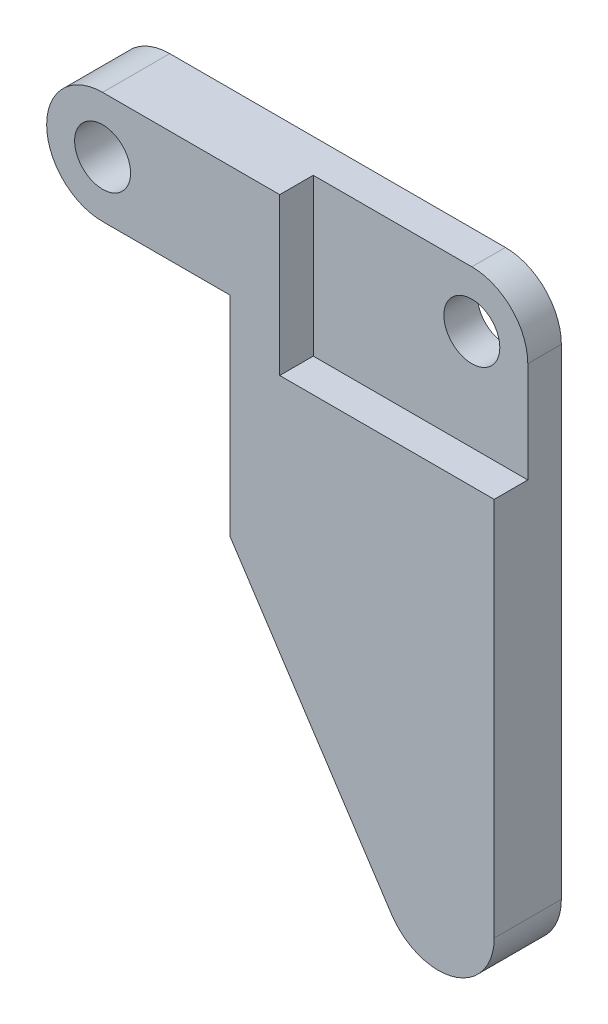
ISO-10303-21;
HEADER;
FILE_DESCRIPTION(('STEP AP214'),'2;1');
FILE_NAME('part.step','',(''),(''),'','','');
FILE_SCHEMA(('AUTOMOTIVE_DESIGN { 1 0 10303 214 1 1 1 1 }'));
ENDSEC;
DATA;
#1=APPLICATION_CONTEXT('core data for automotive mechanical design processes');
#2=APPLICATION_PROTOCOL_DEFINITION('international standard','automotive_design',2000,#1);
#3=PRODUCT_CONTEXT('',#1,'mechanical');
#4=PRODUCT('Part','Part','',(#3));
#5=PRODUCT_RELATED_PRODUCT_CATEGORY('part','',(#4));
#6=PRODUCT_DEFINITION_FORMATION('','',#4);
#7=PRODUCT_DEFINITION_CONTEXT('part definition',#1,'design');
#8=PRODUCT_DEFINITION('design','',#6,#7);
#9=PRODUCT_DEFINITION_SHAPE('','',#8);
#10=(LENGTH_UNIT() NAMED_UNIT(*) SI_UNIT(.MILLI.,.METRE.));
#11=(NAMED_UNIT(*) PLANE_ANGLE_UNIT() SI_UNIT($,.RADIAN.));
#12=(NAMED_UNIT(*) SI_UNIT($,.STERADIAN.) SOLID_ANGLE_UNIT());
#13=UNCERTAINTY_MEASURE_WITH_UNIT(LENGTH_MEASURE(1.E-05),#10,'distance_accuracy_value','');
#14=(GEOMETRIC_REPRESENTATION_CONTEXT(3) GLOBAL_UNCERTAINTY_ASSIGNED_CONTEXT((#13)) GLOBAL_UNIT_ASSIGNED_CONTEXT((#10,
#11,#12)) REPRESENTATION_CONTEXT('',''));
#15=CARTESIAN_POINT('',(0.,0.,0.));
#16=DIRECTION('',(0.,0.,1.));
#17=DIRECTION('',(1.,0.,0.));
#18=AXIS2_PLACEMENT_3D('',#15,#16,#17);
#19=CARTESIAN_POINT('',(30.,0.,6.));
#20=DIRECTION('',(0.,0.,-1.));
#21=DIRECTION('',(-1.,0.,0.));
#22=AXIS2_PLACEMENT_3D('',#19,#20,#21);
#23=CYLINDRICAL_SURFACE('',#22,5.);
#24=CARTESIAN_POINT('',(30.,0.,3.));
#25=DIRECTION('',(0.,0.,1.));
#26=DIRECTION('',(1.,0.,0.));
#27=AXIS2_PLACEMENT_3D('',#24,#25,#26);
#28=CIRCLE('',#27,5.);
#29=CARTESIAN_POINT('',(35.,0.,3.));
#30=VERTEX_POINT('',#29);
#31=CARTESIAN_POINT('',(30.,5.,3.));
#32=VERTEX_POINT('',#31);
#33=EDGE_CURVE('E233',#30,#32,#28,.T.);
#34=ORIENTED_EDGE('',*,*,#33,.F.);
#35=DIRECTION('',(0.,0.,-1.));
#36=VECTOR('',#35,1.);
#37=CARTESIAN_POINT('',(35.,0.,6.));
#38=LINE('',#37,#36);
#39=CARTESIAN_POINT('',(35.,0.,0.));
#40=VERTEX_POINT('',#39);
#41=EDGE_CURVE('E11',#30,#40,#38,.T.);
#42=ORIENTED_EDGE('',*,*,#41,.T.);
#43=CARTESIAN_POINT('',(30.,0.,0.));
#44=DIRECTION('',(0.,0.,1.));
#45=DIRECTION('',(1.,0.,0.));
#46=AXIS2_PLACEMENT_3D('',#43,#44,#45);
#47=CIRCLE('',#46,5.);
#48=CARTESIAN_POINT('',(30.,5.,0.));
#49=VERTEX_POINT('',#48);
#50=EDGE_CURVE('E157',#40,#49,#47,.T.);
#51=ORIENTED_EDGE('',*,*,#50,.T.);
#52=DIRECTION('',(0.,0.,-1.));
#53=VECTOR('',#52,1.);
#54=CARTESIAN_POINT('',(30.,5.,6.));
#55=LINE('',#54,#53);
#56=EDGE_CURVE('E49',#32,#49,#55,.T.);
#57=ORIENTED_EDGE('',*,*,#56,.F.);
#58=EDGE_LOOP('',(#34,#42,#51,#57));
#59=FACE_BOUND('',#58,.T.);
#60=ADVANCED_FACE('F39',(#59),#23,.T.);
#61=CARTESIAN_POINT('',(0.,5.,6.));
#62=DIRECTION('',(0.,1.,0.));
#63=DIRECTION('',(0.,0.,1.));
#64=AXIS2_PLACEMENT_3D('',#61,#62,#63);
#65=PLANE('',#64);
#66=DIRECTION('',(1.,0.,0.));
#67=VECTOR('',#66,1.);
#68=CARTESIAN_POINT('',(0.,5.,6.));
#69=LINE('',#68,#67);
#70=CARTESIAN_POINT('',(0.,5.,6.));
#71=VERTEX_POINT('',#70);
#72=CARTESIAN_POINT('',(15.8287543874692,5.,6.00000000000001));
#73=VERTEX_POINT('',#72);
#74=EDGE_CURVE('E226',#71,#73,#69,.T.);
#75=ORIENTED_EDGE('',*,*,#74,.T.);
#76=DIRECTION('',(0.,0.,-1.));
#77=VECTOR('',#76,1.);
#78=CARTESIAN_POINT('',(15.8287543874692,5.,96.7964118778106));
#79=LINE('',#78,#77);
#80=CARTESIAN_POINT('',(15.8287543874692,5.,3.));
#81=VERTEX_POINT('',#80);
#82=EDGE_CURVE('E238',#73,#81,#79,.T.);
#83=ORIENTED_EDGE('',*,*,#82,.T.);
#84=DIRECTION('',(-1.,0.,0.));
#85=VECTOR('',#84,1.);
#86=CARTESIAN_POINT('',(30.,5.,3.));
#87=LINE('',#86,#85);
#88=EDGE_CURVE('E208',#32,#81,#87,.T.);
#89=ORIENTED_EDGE('',*,*,#88,.F.);
#90=ORIENTED_EDGE('',*,*,#56,.T.);
#91=DIRECTION('',(1.,0.,0.));
#92=VECTOR('',#91,1.);
#93=CARTESIAN_POINT('',(0.,5.,0.));
#94=LINE('',#93,#92);
#95=CARTESIAN_POINT('',(0.,5.,0.));
#96=VERTEX_POINT('',#95);
#97=EDGE_CURVE('E161',#96,#49,#94,.T.);
#98=ORIENTED_EDGE('',*,*,#97,.F.);
#99=DIRECTION('',(0.,0.,-1.));
#100=VECTOR('',#99,1.);
#101=CARTESIAN_POINT('',(0.,5.,6.));
#102=LINE('',#101,#100);
#103=EDGE_CURVE('E103',#71,#96,#102,.T.);
#104=ORIENTED_EDGE('',*,*,#103,.F.);
#105=EDGE_LOOP('',(#75,#83,#89,#90,#98,#104));
#106=FACE_BOUND('',#105,.T.);
#107=ADVANCED_FACE('F204',(#106),#65,.T.);
#108=CARTESIAN_POINT('',(30.,0.,6.));
#109=DIRECTION('',(0.,0.,-1.));
#110=DIRECTION('',(-1.,0.,0.));
#111=AXIS2_PLACEMENT_3D('',#108,#109,#110);
#112=CYLINDRICAL_SURFACE('',#111,2.5);
#113=CARTESIAN_POINT('',(30.,0.,0.));
#114=DIRECTION('',(0.,0.,1.));
#115=DIRECTION('',(1.,0.,0.));
#116=AXIS2_PLACEMENT_3D('',#113,#114,#115);
#117=CIRCLE('',#116,2.5);
#118=CARTESIAN_POINT('',(32.5,0.,0.));
#119=VERTEX_POINT('',#118);
#120=EDGE_CURVE('E181',#119,#119,#117,.T.);
#121=ORIENTED_EDGE('',*,*,#120,.F.);
#122=EDGE_LOOP('',(#121));
#123=FACE_BOUND('',#122,.T.);
#124=CARTESIAN_POINT('',(30.,0.,3.));
#125=DIRECTION('',(0.,0.,1.));
#126=DIRECTION('',(1.,0.,0.));
#127=AXIS2_PLACEMENT_3D('',#124,#125,#126);
#128=CIRCLE('',#127,2.5);
#129=CARTESIAN_POINT('',(32.5,0.,3.));
#130=VERTEX_POINT('',#129);
#131=EDGE_CURVE('E43',#130,#130,#128,.T.);
#132=ORIENTED_EDGE('',*,*,#131,.T.);
#133=EDGE_LOOP('',(#132));
#134=FACE_BOUND('',#133,.T.);
#135=ADVANCED_FACE('F298',(#123,#134),#112,.F.);
#136=CARTESIAN_POINT('',(0.,0.,6.));
#137=DIRECTION('',(0.,0.,1.));
#138=DIRECTION('',(1.,0.,0.));
#139=AXIS2_PLACEMENT_3D('',#136,#137,#138);
#140=PLANE('',#139);
#141=CARTESIAN_POINT('',(0.,0.,6.));
#142=DIRECTION('',(0.,0.,1.));
#143=DIRECTION('',(1.,0.,0.));
#144=AXIS2_PLACEMENT_3D('',#141,#142,#143);
#145=CIRCLE('',#144,2.5);
#146=CARTESIAN_POINT('',(2.5,0.,6.));
#147=VERTEX_POINT('',#146);
#148=EDGE_CURVE('E147',#147,#147,#145,.T.);
#149=ORIENTED_EDGE('',*,*,#148,.F.);
#150=EDGE_LOOP('',(#149));
#151=FACE_BOUND('',#150,.T.);
#152=DIRECTION('',(1.,0.,0.));
#153=VECTOR('',#152,1.);
#154=CARTESIAN_POINT('',(15.8287543874692,-8.99914935237414,6.00000000000001));
#155=LINE('',#154,#153);
#156=CARTESIAN_POINT('',(15.8287543874692,-8.99914935237414,6.));
#157=VERTEX_POINT('',#156);
#158=CARTESIAN_POINT('',(35.,-8.99914935237414,6.00000000000001));
#159=VERTEX_POINT('',#158);
#160=EDGE_CURVE('E261',#157,#159,#155,.T.);
#161=ORIENTED_EDGE('',*,*,#160,.F.);
#162=DIRECTION('',(0.,-1.,0.));
#163=VECTOR('',#162,1.);
#164=CARTESIAN_POINT('',(15.8287543874692,5.,6.00000000000001));
#165=LINE('',#164,#163);
#166=EDGE_CURVE('E241',#73,#157,#165,.T.);
#167=ORIENTED_EDGE('',*,*,#166,.F.);
#168=ORIENTED_EDGE('',*,*,#74,.F.);
#169=CARTESIAN_POINT('',(0.,0.,6.));
#170=DIRECTION('',(0.,0.,1.));
#171=DIRECTION('',(1.,0.,0.));
#172=AXIS2_PLACEMENT_3D('',#169,#170,#171);
#173=CIRCLE('',#172,5.);
#174=CARTESIAN_POINT('',(0.,-5.,6.));
#175=VERTEX_POINT('',#174);
#176=EDGE_CURVE('E224',#71,#175,#173,.T.);
#177=ORIENTED_EDGE('',*,*,#176,.T.);
#178=DIRECTION('',(1.,0.,0.));
#179=VECTOR('',#178,1.);
#180=CARTESIAN_POINT('',(0.,-5.,6.));
#181=LINE('',#180,#179);
#182=CARTESIAN_POINT('',(11.394465816433,-5.,6.));
#183=VERTEX_POINT('',#182);
#184=EDGE_CURVE('E138',#175,#183,#181,.T.);
#185=ORIENTED_EDGE('',*,*,#184,.T.);
#186=DIRECTION('',(0.,1.,0.));
#187=VECTOR('',#186,1.);
#188=CARTESIAN_POINT('',(11.394465816433,0.,6.));
#189=LINE('',#188,#187);
#190=CARTESIAN_POINT('',(11.394465816433,-23.6851596479489,6.));
#191=VERTEX_POINT('',#190);
#192=EDGE_CURVE('E119',#191,#183,#189,.T.);
#193=ORIENTED_EDGE('',*,*,#192,.F.);
#194=DIRECTION('',(-0.548058190153142,0.836440207191203,0.));
#195=VECTOR('',#194,1.);
#196=CARTESIAN_POINT('',(-2.88576587482486,-1.89083165654264,6.));
#197=LINE('',#196,#195);
#198=CARTESIAN_POINT('',(25.8177989640439,-45.6978874624978,6.));
#199=VERTEX_POINT('',#198);
#200=EDGE_CURVE('E135',#199,#191,#197,.T.);
#201=ORIENTED_EDGE('',*,*,#200,.F.);
#202=CARTESIAN_POINT('',(30.,-42.9575965117322,6.));
#203=DIRECTION('',(0.,0.,1.));
#204=DIRECTION('',(1.,0.,0.));
#205=AXIS2_PLACEMENT_3D('',#202,#203,#204);
#206=CIRCLE('',#205,5.);
#207=CARTESIAN_POINT('',(35.,-42.957596511732,6.));
#208=VERTEX_POINT('',#207);
#209=EDGE_CURVE('E144',#208,#199,#206,.F.);
#210=ORIENTED_EDGE('',*,*,#209,.F.);
#211=DIRECTION('',(0.,-1.,0.));
#212=VECTOR('',#211,1.);
#213=CARTESIAN_POINT('',(35.,0.,6.));
#214=LINE('',#213,#212);
#215=EDGE_CURVE('E65',#159,#208,#214,.T.);
#216=ORIENTED_EDGE('',*,*,#215,.F.);
#217=EDGE_LOOP('',(#161,#167,#168,#177,#185,#193,#201,#210,#216));
#218=FACE_BOUND('',#217,.T.);
#219=ADVANCED_FACE('F133',(#151,#218),#140,.T.);
#220=CARTESIAN_POINT('',(35.,0.,6.));
#221=DIRECTION('',(1.,0.,0.));
#222=DIRECTION('',(0.,0.,-1.));
#223=AXIS2_PLACEMENT_3D('',#220,#221,#222);
#224=PLANE('',#223);
#225=DIRECTION('',(0.,0.,-1.));
#226=VECTOR('',#225,1.);
#227=CARTESIAN_POINT('',(35.,-8.99914935237414,96.7964118778106));
#228=LINE('',#227,#226);
#229=CARTESIAN_POINT('',(35.,-8.99914935237414,3.));
#230=VERTEX_POINT('',#229);
#231=EDGE_CURVE('E244',#159,#230,#228,.T.);
#232=ORIENTED_EDGE('',*,*,#231,.F.);
#233=ORIENTED_EDGE('',*,*,#215,.T.);
#234=DIRECTION('',(0.,0.,-1.));
#235=VECTOR('',#234,1.);
#236=CARTESIAN_POINT('',(35.,-42.957596511732,6.));
#237=LINE('',#236,#235);
#238=CARTESIAN_POINT('',(35.,-42.957596511732,0.));
#239=VERTEX_POINT('',#238);
#240=EDGE_CURVE('E95',#208,#239,#237,.T.);
#241=ORIENTED_EDGE('',*,*,#240,.T.);
#242=DIRECTION('',(0.,-1.,0.));
#243=VECTOR('',#242,1.);
#244=CARTESIAN_POINT('',(35.,0.,0.));
#245=LINE('',#244,#243);
#246=EDGE_CURVE('E154',#40,#239,#245,.T.);
#247=ORIENTED_EDGE('',*,*,#246,.F.);
#248=ORIENTED_EDGE('',*,*,#41,.F.);
#249=DIRECTION('',(0.,1.,0.));
#250=VECTOR('',#249,1.);
#251=CARTESIAN_POINT('',(35.,-8.99914935237414,3.));
#252=LINE('',#251,#250);
#253=EDGE_CURVE('E237',#230,#30,#252,.T.);
#254=ORIENTED_EDGE('',*,*,#253,.F.);
#255=EDGE_LOOP('',(#232,#233,#241,#247,#248,#254));
#256=FACE_BOUND('',#255,.T.);
#257=ADVANCED_FACE('F41',(#256),#224,.T.);
#258=CARTESIAN_POINT('',(0.,0.,6.));
#259=DIRECTION('',(0.,0.,-1.));
#260=DIRECTION('',(-1.,0.,0.));
#261=AXIS2_PLACEMENT_3D('',#258,#259,#260);
#262=CYLINDRICAL_SURFACE('',#261,5.);
#263=CARTESIAN_POINT('',(0.,0.,0.));
#264=DIRECTION('',(0.,0.,1.));
#265=DIRECTION('',(1.,0.,0.));
#266=AXIS2_PLACEMENT_3D('',#263,#264,#265);
#267=CIRCLE('',#266,5.);
#268=CARTESIAN_POINT('',(0.,-5.,0.));
#269=VERTEX_POINT('',#268);
#270=EDGE_CURVE('E165',#96,#269,#267,.T.);
#271=ORIENTED_EDGE('',*,*,#270,.T.);
#272=DIRECTION('',(0.,0.,-1.));
#273=VECTOR('',#272,1.);
#274=CARTESIAN_POINT('',(0.,-5.,6.));
#275=LINE('',#274,#273);
#276=EDGE_CURVE('E195',#175,#269,#275,.T.);
#277=ORIENTED_EDGE('',*,*,#276,.F.);
#278=ORIENTED_EDGE('',*,*,#176,.F.);
#279=ORIENTED_EDGE('',*,*,#103,.T.);
#280=EDGE_LOOP('',(#271,#277,#278,#279));
#281=FACE_BOUND('',#280,.T.);
#282=ADVANCED_FACE('F220',(#281),#262,.T.);
#283=CARTESIAN_POINT('',(0.,-5.,6.));
#284=DIRECTION('',(0.,1.,0.));
#285=DIRECTION('',(0.,0.,1.));
#286=AXIS2_PLACEMENT_3D('',#283,#284,#285);
#287=PLANE('',#286);
#288=DIRECTION('',(1.,0.,0.));
#289=VECTOR('',#288,1.);
#290=CARTESIAN_POINT('',(0.,-5.,0.));
#291=LINE('',#290,#289);
#292=CARTESIAN_POINT('',(11.394465816433,-5.,0.));
#293=VERTEX_POINT('',#292);
#294=EDGE_CURVE('E168',#269,#293,#291,.T.);
#295=ORIENTED_EDGE('',*,*,#294,.T.);
#296=DIRECTION('',(0.,0.,-1.));
#297=VECTOR('',#296,1.);
#298=CARTESIAN_POINT('',(11.394465816433,-5.,6.));
#299=LINE('',#298,#297);
#300=EDGE_CURVE('E127',#183,#293,#299,.T.);
#301=ORIENTED_EDGE('',*,*,#300,.F.);
#302=ORIENTED_EDGE('',*,*,#184,.F.);
#303=ORIENTED_EDGE('',*,*,#276,.T.);
#304=EDGE_LOOP('',(#295,#301,#302,#303));
#305=FACE_BOUND('',#304,.T.);
#306=ADVANCED_FACE('F222',(#305),#287,.F.);
#307=CARTESIAN_POINT('',(11.394465816433,0.,6.));
#308=DIRECTION('',(-1.,0.,0.));
#309=DIRECTION('',(0.,0.,1.));
#310=AXIS2_PLACEMENT_3D('',#307,#308,#309);
#311=PLANE('',#310);
#312=DIRECTION('',(0.,1.,0.));
#313=VECTOR('',#312,1.);
#314=CARTESIAN_POINT('',(11.394465816433,0.,0.));
#315=LINE('',#314,#313);
#316=CARTESIAN_POINT('',(11.394465816433,-23.6851596479489,0.));
#317=VERTEX_POINT('',#316);
#318=EDGE_CURVE('E121',#317,#293,#315,.T.);
#319=ORIENTED_EDGE('',*,*,#318,.F.);
#320=DIRECTION('',(0.,0.,-1.));
#321=VECTOR('',#320,1.);
#322=CARTESIAN_POINT('',(11.394465816433,-23.6851596479489,6.));
#323=LINE('',#322,#321);
#324=EDGE_CURVE('E116',#191,#317,#323,.T.);
#325=ORIENTED_EDGE('',*,*,#324,.F.);
#326=ORIENTED_EDGE('',*,*,#192,.T.);
#327=ORIENTED_EDGE('',*,*,#300,.T.);
#328=EDGE_LOOP('',(#319,#325,#326,#327));
#329=FACE_BOUND('',#328,.T.);
#330=ADVANCED_FACE('F118',(#329),#311,.T.);
#331=CARTESIAN_POINT('',(-2.88576587482486,-1.89083165654264,6.));
#332=DIRECTION('',(-0.836440207191202,-0.548058190153142,0.));
#333=DIRECTION('',(0.548058190153142,-0.836440207191203,0.));
#334=AXIS2_PLACEMENT_3D('',#331,#332,#333);
#335=PLANE('',#334);
#336=DIRECTION('',(-0.548058190153142,0.836440207191203,0.));
#337=VECTOR('',#336,1.);
#338=CARTESIAN_POINT('',(-2.88576587482486,-1.89083165654264,0.));
#339=LINE('',#338,#337);
#340=CARTESIAN_POINT('',(25.8177989640439,-45.6978874624978,0.));
#341=VERTEX_POINT('',#340);
#342=EDGE_CURVE('E174',#341,#317,#339,.T.);
#343=ORIENTED_EDGE('',*,*,#342,.F.);
#344=DIRECTION('',(0.,0.,-1.));
#345=VECTOR('',#344,1.);
#346=CARTESIAN_POINT('',(25.8177989640439,-45.6978874624978,6.));
#347=LINE('',#346,#345);
#348=EDGE_CURVE('E128',#199,#341,#347,.T.);
#349=ORIENTED_EDGE('',*,*,#348,.F.);
#350=ORIENTED_EDGE('',*,*,#200,.T.);
#351=ORIENTED_EDGE('',*,*,#324,.T.);
#352=EDGE_LOOP('',(#343,#349,#350,#351));
#353=FACE_BOUND('',#352,.T.);
#354=ADVANCED_FACE('F142',(#353),#335,.T.);
#355=CARTESIAN_POINT('',(30.,-42.9575965117322,6.));
#356=DIRECTION('',(0.,0.,-1.));
#357=DIRECTION('',(-1.,0.,0.));
#358=AXIS2_PLACEMENT_3D('',#355,#356,#357);
#359=CYLINDRICAL_SURFACE('',#358,5.);
#360=CARTESIAN_POINT('',(30.,-42.9575965117322,0.));
#361=DIRECTION('',(0.,0.,1.));
#362=DIRECTION('',(1.,0.,0.));
#363=AXIS2_PLACEMENT_3D('',#360,#361,#362);
#364=CIRCLE('',#363,5.);
#365=EDGE_CURVE('E177',#239,#341,#364,.F.);
#366=ORIENTED_EDGE('',*,*,#365,.F.);
#367=ORIENTED_EDGE('',*,*,#240,.F.);
#368=ORIENTED_EDGE('',*,*,#209,.T.);
#369=ORIENTED_EDGE('',*,*,#348,.T.);
#370=EDGE_LOOP('',(#366,#367,#368,#369));
#371=FACE_BOUND('',#370,.T.);
#372=ADVANCED_FACE('F309',(#371),#359,.T.);
#373=CARTESIAN_POINT('',(0.,0.,6.));
#374=DIRECTION('',(0.,0.,-1.));
#375=DIRECTION('',(-1.,0.,0.));
#376=AXIS2_PLACEMENT_3D('',#373,#374,#375);
#377=CYLINDRICAL_SURFACE('',#376,2.5);
#378=ORIENTED_EDGE('',*,*,#148,.T.);
#379=EDGE_LOOP('',(#378));
#380=FACE_BOUND('',#379,.T.);
#381=CARTESIAN_POINT('',(0.,0.,0.));
#382=DIRECTION('',(0.,0.,1.));
#383=DIRECTION('',(1.,0.,0.));
#384=AXIS2_PLACEMENT_3D('',#381,#382,#383);
#385=CIRCLE('',#384,2.5);
#386=CARTESIAN_POINT('',(2.5,0.,0.));
#387=VERTEX_POINT('',#386);
#388=EDGE_CURVE('E185',#387,#387,#385,.T.);
#389=ORIENTED_EDGE('',*,*,#388,.F.);
#390=EDGE_LOOP('',(#389));
#391=FACE_BOUND('',#390,.T.);
#392=ADVANCED_FACE('F312',(#380,#391),#377,.F.);
#393=CARTESIAN_POINT('',(0.,0.,0.));
#394=DIRECTION('',(0.,0.,1.));
#395=DIRECTION('',(1.,0.,0.));
#396=AXIS2_PLACEMENT_3D('',#393,#394,#395);
#397=PLANE('',#396);
#398=ORIENTED_EDGE('',*,*,#246,.T.);
#399=ORIENTED_EDGE('',*,*,#365,.T.);
#400=ORIENTED_EDGE('',*,*,#342,.T.);
#401=ORIENTED_EDGE('',*,*,#318,.T.);
#402=ORIENTED_EDGE('',*,*,#294,.F.);
#403=ORIENTED_EDGE('',*,*,#270,.F.);
#404=ORIENTED_EDGE('',*,*,#97,.T.);
#405=ORIENTED_EDGE('',*,*,#50,.F.);
#406=EDGE_LOOP('',(#398,#399,#400,#401,#402,#403,#404,#405));
#407=FACE_BOUND('',#406,.T.);
#408=ORIENTED_EDGE('',*,*,#120,.T.);
#409=EDGE_LOOP('',(#408));
#410=FACE_BOUND('',#409,.T.);
#411=ORIENTED_EDGE('',*,*,#388,.T.);
#412=EDGE_LOOP('',(#411));
#413=FACE_BOUND('',#412,.T.);
#414=ADVANCED_FACE('F215',(#407,#410,#413),#397,.F.);
#415=CARTESIAN_POINT('',(15.8287543874692,5.,96.7964118778106));
#416=DIRECTION('',(1.,0.,0.));
#417=DIRECTION('',(0.,0.,-1.));
#418=AXIS2_PLACEMENT_3D('',#415,#416,#417);
#419=PLANE('',#418);
#420=ORIENTED_EDGE('',*,*,#82,.F.);
#421=ORIENTED_EDGE('',*,*,#166,.T.);
#422=DIRECTION('',(0.,0.,-1.));
#423=VECTOR('',#422,1.);
#424=CARTESIAN_POINT('',(15.8287543874692,-8.99914935237414,96.7964118778106));
#425=LINE('',#424,#423);
#426=CARTESIAN_POINT('',(15.8287543874692,-8.99914935237414,3.));
#427=VERTEX_POINT('',#426);
#428=EDGE_CURVE('E56',#157,#427,#425,.T.);
#429=ORIENTED_EDGE('',*,*,#428,.T.);
#430=DIRECTION('',(0.,-1.,0.));
#431=VECTOR('',#430,1.);
#432=CARTESIAN_POINT('',(15.8287543874692,5.,3.));
#433=LINE('',#432,#431);
#434=EDGE_CURVE('E250',#81,#427,#433,.T.);
#435=ORIENTED_EDGE('',*,*,#434,.F.);
#436=EDGE_LOOP('',(#420,#421,#429,#435));
#437=FACE_BOUND('',#436,.T.);
#438=ADVANCED_FACE('F268',(#437),#419,.T.);
#439=CARTESIAN_POINT('',(15.8287543874692,-8.99914935237414,96.7964118778106));
#440=DIRECTION('',(0.,1.,0.));
#441=DIRECTION('',(0.,0.,1.));
#442=AXIS2_PLACEMENT_3D('',#439,#440,#441);
#443=PLANE('',#442);
#444=ORIENTED_EDGE('',*,*,#428,.F.);
#445=ORIENTED_EDGE('',*,*,#160,.T.);
#446=ORIENTED_EDGE('',*,*,#231,.T.);
#447=DIRECTION('',(1.,0.,0.));
#448=VECTOR('',#447,1.);
#449=CARTESIAN_POINT('',(15.8287543874692,-8.99914935237414,3.));
#450=LINE('',#449,#448);
#451=EDGE_CURVE('E254',#427,#230,#450,.T.);
#452=ORIENTED_EDGE('',*,*,#451,.F.);
#453=EDGE_LOOP('',(#444,#445,#446,#452));
#454=FACE_BOUND('',#453,.T.);
#455=ADVANCED_FACE('F273',(#454),#443,.T.);
#456=CARTESIAN_POINT('',(0.,0.,3.));
#457=DIRECTION('',(0.,0.,1.));
#458=DIRECTION('',(1.,0.,0.));
#459=AXIS2_PLACEMENT_3D('',#456,#457,#458);
#460=PLANE('',#459);
#461=ORIENTED_EDGE('',*,*,#131,.F.);
#462=EDGE_LOOP('',(#461));
#463=FACE_BOUND('',#462,.T.);
#464=ORIENTED_EDGE('',*,*,#451,.T.);
#465=ORIENTED_EDGE('',*,*,#253,.T.);
#466=ORIENTED_EDGE('',*,*,#33,.T.);
#467=ORIENTED_EDGE('',*,*,#88,.T.);
#468=ORIENTED_EDGE('',*,*,#434,.T.);
#469=EDGE_LOOP('',(#464,#465,#466,#467,#468));
#470=FACE_BOUND('',#469,.T.);
#471=ADVANCED_FACE('F279',(#463,#470),#460,.T.);
#472=CLOSED_SHELL('',(#60,#107,#135,#219,#257,#282,#306,#330,#354,#372,#392,#414,#438,#455,#471));
#473=MANIFOLD_SOLID_BREP('B2',#472);
#474=ADVANCED_BREP_SHAPE_REPRESENTATION('',(#18,#473),#14);
#475=SHAPE_DEFINITION_REPRESENTATION(#9,#474);
ENDSEC;
END-ISO-10303-21;
